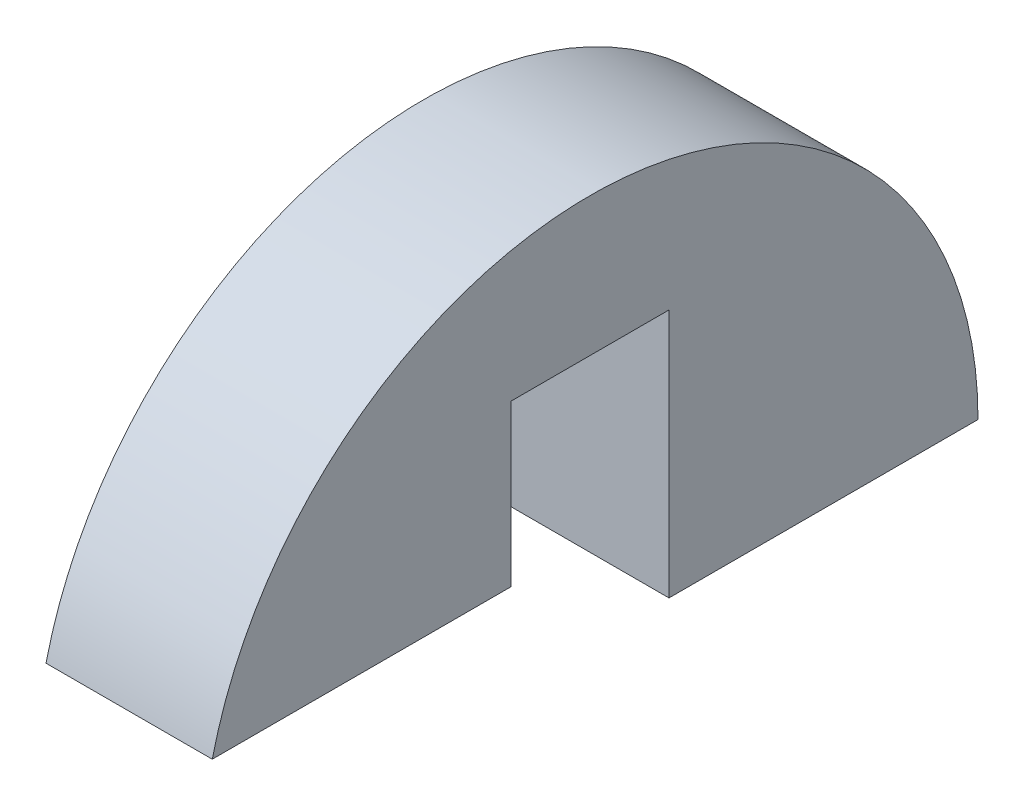
ISO-10303-21;
HEADER;
FILE_DESCRIPTION(('STEP AP214'),'2;1');
FILE_NAME('part.step','',(''),(''),'','','');
FILE_SCHEMA(('AUTOMOTIVE_DESIGN { 1 0 10303 214 1 1 1 1 }'));
ENDSEC;
DATA;
#1=APPLICATION_CONTEXT('core data for automotive mechanical design processes');
#2=APPLICATION_PROTOCOL_DEFINITION('international standard','automotive_design',2000,#1);
#3=PRODUCT_CONTEXT('',#1,'mechanical');
#4=PRODUCT('Part','Part','',(#3));
#5=PRODUCT_RELATED_PRODUCT_CATEGORY('part','',(#4));
#6=PRODUCT_DEFINITION_FORMATION('','',#4);
#7=PRODUCT_DEFINITION_CONTEXT('part definition',#1,'design');
#8=PRODUCT_DEFINITION('design','',#6,#7);
#9=PRODUCT_DEFINITION_SHAPE('','',#8);
#10=(LENGTH_UNIT() NAMED_UNIT(*) SI_UNIT(.MILLI.,.METRE.));
#11=(NAMED_UNIT(*) PLANE_ANGLE_UNIT() SI_UNIT($,.RADIAN.));
#12=(NAMED_UNIT(*) SI_UNIT($,.STERADIAN.) SOLID_ANGLE_UNIT());
#13=UNCERTAINTY_MEASURE_WITH_UNIT(LENGTH_MEASURE(1.E-05),#10,'distance_accuracy_value','');
#14=(GEOMETRIC_REPRESENTATION_CONTEXT(3) GLOBAL_UNCERTAINTY_ASSIGNED_CONTEXT((#13)) GLOBAL_UNIT_ASSIGNED_CONTEXT((#10,
#11,#12)) REPRESENTATION_CONTEXT('',''));
#15=CARTESIAN_POINT('',(0.,0.,0.));
#16=DIRECTION('',(0.,0.,1.));
#17=DIRECTION('',(1.,0.,0.));
#18=AXIS2_PLACEMENT_3D('',#15,#16,#17);
#19=CARTESIAN_POINT('',(1.49999999999999,1.60000000000001,1.425));
#20=DIRECTION('',(0.,-1.,0.));
#21=DIRECTION('',(0.,0.,1.));
#22=AXIS2_PLACEMENT_3D('',#19,#20,#21);
#23=PLANE('',#22);
#24=DIRECTION('',(-1.,0.,0.));
#25=VECTOR('',#24,1.);
#26=CARTESIAN_POINT('',(1.49999999999999,1.60000000000001,6.81469001496033));
#27=LINE('',#26,#25);
#28=CARTESIAN_POINT('',(1.49999999999999,1.60000000000001,6.81469001496033));
#29=VERTEX_POINT('',#28);
#30=CARTESIAN_POINT('',(-1.50000000000001,1.59999999999999,6.81469001496033));
#31=VERTEX_POINT('',#30);
#32=EDGE_CURVE('E11',#29,#31,#27,.T.);
#33=ORIENTED_EDGE('',*,*,#32,.T.);
#34=DIRECTION('',(0.,0.,1.));
#35=VECTOR('',#34,1.);
#36=CARTESIAN_POINT('',(-1.50000000000001,1.59999999999999,1.425));
#37=LINE('',#36,#35);
#38=CARTESIAN_POINT('',(-1.50000000000001,1.59999999999999,1.425));
#39=VERTEX_POINT('',#38);
#40=EDGE_CURVE('E101',#39,#31,#37,.T.);
#41=ORIENTED_EDGE('',*,*,#40,.F.);
#42=DIRECTION('',(-1.,0.,0.));
#43=VECTOR('',#42,1.);
#44=CARTESIAN_POINT('',(1.49999999999999,1.60000000000001,1.425));
#45=LINE('',#44,#43);
#46=CARTESIAN_POINT('',(1.49999999999999,1.60000000000001,1.425));
#47=VERTEX_POINT('',#46);
#48=EDGE_CURVE('E42',#47,#39,#45,.T.);
#49=ORIENTED_EDGE('',*,*,#48,.F.);
#50=DIRECTION('',(0.,0.,1.));
#51=VECTOR('',#50,1.);
#52=CARTESIAN_POINT('',(1.49999999999999,1.60000000000001,1.425));
#53=LINE('',#52,#51);
#54=EDGE_CURVE('E92',#47,#29,#53,.T.);
#55=ORIENTED_EDGE('',*,*,#54,.T.);
#56=EDGE_LOOP('',(#33,#41,#49,#55));
#57=FACE_BOUND('',#56,.T.);
#58=ADVANCED_FACE('F33',(#57),#23,.T.);
#59=CARTESIAN_POINT('',(1.49999999999998,4.5,1.425));
#60=DIRECTION('',(0.,0.,-1.));
#61=DIRECTION('',(0.,-1.,0.));
#62=AXIS2_PLACEMENT_3D('',#59,#60,#61);
#63=PLANE('',#62);
#64=ORIENTED_EDGE('',*,*,#48,.T.);
#65=DIRECTION('',(0.,-1.,0.));
#66=VECTOR('',#65,1.);
#67=CARTESIAN_POINT('',(-1.50000000000002,4.49999999999999,1.425));
#68=LINE('',#67,#66);
#69=CARTESIAN_POINT('',(-1.50000000000002,4.49999999999999,1.425));
#70=VERTEX_POINT('',#69);
#71=EDGE_CURVE('E111',#70,#39,#68,.T.);
#72=ORIENTED_EDGE('',*,*,#71,.F.);
#73=DIRECTION('',(-1.,0.,0.));
#74=VECTOR('',#73,1.);
#75=CARTESIAN_POINT('',(1.49999999999998,4.5,1.425));
#76=LINE('',#75,#74);
#77=CARTESIAN_POINT('',(1.49999999999998,4.5,1.425));
#78=VERTEX_POINT('',#77);
#79=EDGE_CURVE('E126',#78,#70,#76,.T.);
#80=ORIENTED_EDGE('',*,*,#79,.F.);
#81=DIRECTION('',(0.,-1.,0.));
#82=VECTOR('',#81,1.);
#83=CARTESIAN_POINT('',(1.49999999999998,4.5,1.425));
#84=LINE('',#83,#82);
#85=EDGE_CURVE('E122',#78,#47,#84,.T.);
#86=ORIENTED_EDGE('',*,*,#85,.T.);
#87=EDGE_LOOP('',(#64,#72,#80,#86));
#88=FACE_BOUND('',#87,.T.);
#89=ADVANCED_FACE('F140',(#88),#63,.T.);
#90=CARTESIAN_POINT('',(1.49999999999998,4.5,-1.425));
#91=DIRECTION('',(0.,-1.,0.));
#92=DIRECTION('',(0.,0.,1.));
#93=AXIS2_PLACEMENT_3D('',#90,#91,#92);
#94=PLANE('',#93);
#95=ORIENTED_EDGE('',*,*,#79,.T.);
#96=DIRECTION('',(0.,0.,1.));
#97=VECTOR('',#96,1.);
#98=CARTESIAN_POINT('',(-1.50000000000002,4.49999999999999,-1.425));
#99=LINE('',#98,#97);
#100=CARTESIAN_POINT('',(-1.50000000000002,4.49999999999999,-1.425));
#101=VERTEX_POINT('',#100);
#102=EDGE_CURVE('E106',#101,#70,#99,.T.);
#103=ORIENTED_EDGE('',*,*,#102,.F.);
#104=DIRECTION('',(-1.,0.,0.));
#105=VECTOR('',#104,1.);
#106=CARTESIAN_POINT('',(1.49999999999998,4.5,-1.425));
#107=LINE('',#106,#105);
#108=CARTESIAN_POINT('',(1.49999999999998,4.5,-1.425));
#109=VERTEX_POINT('',#108);
#110=EDGE_CURVE('E128',#109,#101,#107,.T.);
#111=ORIENTED_EDGE('',*,*,#110,.F.);
#112=DIRECTION('',(0.,0.,1.));
#113=VECTOR('',#112,1.);
#114=CARTESIAN_POINT('',(1.49999999999998,4.5,-1.425));
#115=LINE('',#114,#113);
#116=EDGE_CURVE('E119',#109,#78,#115,.T.);
#117=ORIENTED_EDGE('',*,*,#116,.T.);
#118=EDGE_LOOP('',(#95,#103,#111,#117));
#119=FACE_BOUND('',#118,.T.);
#120=ADVANCED_FACE('F137',(#119),#94,.T.);
#121=CARTESIAN_POINT('',(1.49999999999999,1.60000000000001,-1.425));
#122=DIRECTION('',(0.,0.,1.));
#123=DIRECTION('',(0.,1.,0.));
#124=AXIS2_PLACEMENT_3D('',#121,#122,#123);
#125=PLANE('',#124);
#126=ORIENTED_EDGE('',*,*,#110,.T.);
#127=DIRECTION('',(0.,1.,0.));
#128=VECTOR('',#127,1.);
#129=CARTESIAN_POINT('',(-1.50000000000001,1.59999999999999,-1.425));
#130=LINE('',#129,#128);
#131=CARTESIAN_POINT('',(-1.5,0.,-1.425));
#132=VERTEX_POINT('',#131);
#133=EDGE_CURVE('E104',#132,#101,#130,.T.);
#134=ORIENTED_EDGE('',*,*,#133,.F.);
#135=DIRECTION('',(-1.,0.,0.));
#136=VECTOR('',#135,1.);
#137=CARTESIAN_POINT('',(1.5,0.,-1.425));
#138=LINE('',#137,#136);
#139=CARTESIAN_POINT('',(1.5,0.,-1.425));
#140=VERTEX_POINT('',#139);
#141=EDGE_CURVE('E91',#140,#132,#138,.T.);
#142=ORIENTED_EDGE('',*,*,#141,.F.);
#143=DIRECTION('',(0.,1.,0.));
#144=VECTOR('',#143,1.);
#145=CARTESIAN_POINT('',(1.49999999999999,1.60000000000001,-1.425));
#146=LINE('',#145,#144);
#147=EDGE_CURVE('E117',#140,#109,#146,.T.);
#148=ORIENTED_EDGE('',*,*,#147,.T.);
#149=EDGE_LOOP('',(#126,#134,#142,#148));
#150=FACE_BOUND('',#149,.T.);
#151=ADVANCED_FACE('F131',(#150),#125,.T.);
#152=CARTESIAN_POINT('',(1.5,0.,-1.425));
#153=DIRECTION('',(0.,-1.,0.));
#154=DIRECTION('',(0.,0.,1.));
#155=AXIS2_PLACEMENT_3D('',#152,#153,#154);
#156=PLANE('',#155);
#157=ORIENTED_EDGE('',*,*,#141,.T.);
#158=DIRECTION('',(0.,0.,1.));
#159=VECTOR('',#158,1.);
#160=CARTESIAN_POINT('',(-1.5,0.,-1.425));
#161=LINE('',#160,#159);
#162=CARTESIAN_POINT('',(-1.5,0.,-7.));
#163=VERTEX_POINT('',#162);
#164=EDGE_CURVE('E98',#163,#132,#161,.T.);
#165=ORIENTED_EDGE('',*,*,#164,.F.);
#166=DIRECTION('',(-1.,0.,0.));
#167=VECTOR('',#166,1.);
#168=CARTESIAN_POINT('',(1.5,0.,-7.));
#169=LINE('',#168,#167);
#170=CARTESIAN_POINT('',(1.5,0.,-7.));
#171=VERTEX_POINT('',#170);
#172=EDGE_CURVE('E37',#171,#163,#169,.T.);
#173=ORIENTED_EDGE('',*,*,#172,.F.);
#174=DIRECTION('',(0.,0.,1.));
#175=VECTOR('',#174,1.);
#176=CARTESIAN_POINT('',(1.5,0.,-1.425));
#177=LINE('',#176,#175);
#178=EDGE_CURVE('E115',#171,#140,#177,.T.);
#179=ORIENTED_EDGE('',*,*,#178,.T.);
#180=EDGE_LOOP('',(#157,#165,#173,#179));
#181=FACE_BOUND('',#180,.T.);
#182=ADVANCED_FACE('F103',(#181),#156,.T.);
#183=CARTESIAN_POINT('',(1.5,0.,0.));
#184=DIRECTION('',(-1.,0.,0.));
#185=DIRECTION('',(0.,0.,1.));
#186=AXIS2_PLACEMENT_3D('',#183,#184,#185);
#187=CYLINDRICAL_SURFACE('',#186,7.);
#188=ORIENTED_EDGE('',*,*,#172,.T.);
#189=CARTESIAN_POINT('',(-1.5,0.,0.));
#190=DIRECTION('',(-1.,0.,0.));
#191=DIRECTION('',(0.,0.,1.));
#192=AXIS2_PLACEMENT_3D('',#189,#190,#191);
#193=CIRCLE('',#192,7.);
#194=EDGE_CURVE('E85',#31,#163,#193,.T.);
#195=ORIENTED_EDGE('',*,*,#194,.F.);
#196=ORIENTED_EDGE('',*,*,#32,.F.);
#197=CARTESIAN_POINT('',(1.5,0.,0.));
#198=DIRECTION('',(-1.,0.,0.));
#199=DIRECTION('',(0.,0.,1.));
#200=AXIS2_PLACEMENT_3D('',#197,#198,#199);
#201=CIRCLE('',#200,7.);
#202=EDGE_CURVE('E86',#29,#171,#201,.T.);
#203=ORIENTED_EDGE('',*,*,#202,.T.);
#204=EDGE_LOOP('',(#188,#195,#196,#203));
#205=FACE_BOUND('',#204,.T.);
#206=ADVANCED_FACE('F35',(#205),#187,.T.);
#207=CARTESIAN_POINT('',(1.5,0.,0.));
#208=DIRECTION('',(-1.,0.,0.));
#209=DIRECTION('',(0.,0.,1.));
#210=AXIS2_PLACEMENT_3D('',#207,#208,#209);
#211=PLANE('',#210);
#212=ORIENTED_EDGE('',*,*,#202,.F.);
#213=ORIENTED_EDGE('',*,*,#54,.F.);
#214=ORIENTED_EDGE('',*,*,#85,.F.);
#215=ORIENTED_EDGE('',*,*,#116,.F.);
#216=ORIENTED_EDGE('',*,*,#147,.F.);
#217=ORIENTED_EDGE('',*,*,#178,.F.);
#218=EDGE_LOOP('',(#212,#213,#214,#215,#216,#217));
#219=FACE_BOUND('',#218,.T.);
#220=ADVANCED_FACE('F143',(#219),#211,.F.);
#221=CARTESIAN_POINT('',(-1.5,0.,0.));
#222=DIRECTION('',(-1.,0.,0.));
#223=DIRECTION('',(0.,0.,1.));
#224=AXIS2_PLACEMENT_3D('',#221,#222,#223);
#225=PLANE('',#224);
#226=ORIENTED_EDGE('',*,*,#194,.T.);
#227=ORIENTED_EDGE('',*,*,#164,.T.);
#228=ORIENTED_EDGE('',*,*,#133,.T.);
#229=ORIENTED_EDGE('',*,*,#102,.T.);
#230=ORIENTED_EDGE('',*,*,#71,.T.);
#231=ORIENTED_EDGE('',*,*,#40,.T.);
#232=EDGE_LOOP('',(#226,#227,#228,#229,#230,#231));
#233=FACE_BOUND('',#232,.T.);
#234=ADVANCED_FACE('F96',(#233),#225,.T.);
#235=CLOSED_SHELL('',(#58,#89,#120,#151,#182,#206,#220,#234));
#236=MANIFOLD_SOLID_BREP('B2',#235);
#237=ADVANCED_BREP_SHAPE_REPRESENTATION('',(#18,#236),#14);
#238=SHAPE_DEFINITION_REPRESENTATION(#9,#237);
ENDSEC;
END-ISO-10303-21;
